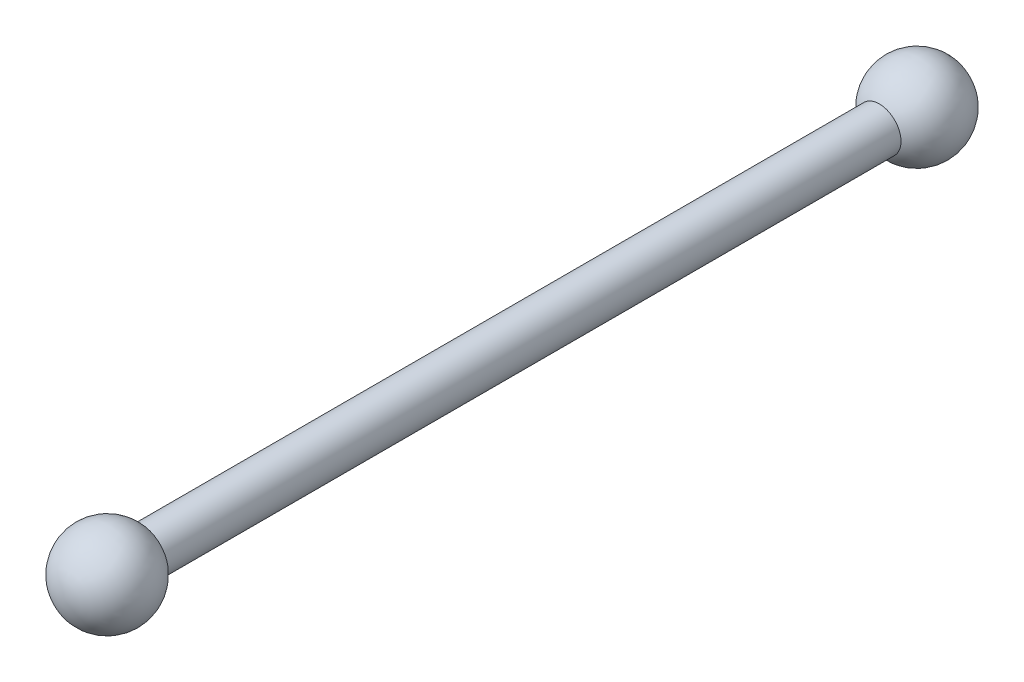
ISO-10303-21;
HEADER;
FILE_DESCRIPTION(('STEP AP214'),'2;1');
FILE_NAME('part.step','',(''),(''),'','','');
FILE_SCHEMA(('AUTOMOTIVE_DESIGN { 1 0 10303 214 1 1 1 1 }'));
ENDSEC;
DATA;
#1=APPLICATION_CONTEXT('core data for automotive mechanical design processes');
#2=APPLICATION_PROTOCOL_DEFINITION('international standard','automotive_design',2000,#1);
#3=PRODUCT_CONTEXT('',#1,'mechanical');
#4=PRODUCT('Part','Part','',(#3));
#5=PRODUCT_RELATED_PRODUCT_CATEGORY('part','',(#4));
#6=PRODUCT_DEFINITION_FORMATION('','',#4);
#7=PRODUCT_DEFINITION_CONTEXT('part definition',#1,'design');
#8=PRODUCT_DEFINITION('design','',#6,#7);
#9=PRODUCT_DEFINITION_SHAPE('','',#8);
#10=(LENGTH_UNIT() NAMED_UNIT(*) SI_UNIT(.MILLI.,.METRE.));
#11=(NAMED_UNIT(*) PLANE_ANGLE_UNIT() SI_UNIT($,.RADIAN.));
#12=(NAMED_UNIT(*) SI_UNIT($,.STERADIAN.) SOLID_ANGLE_UNIT());
#13=UNCERTAINTY_MEASURE_WITH_UNIT(LENGTH_MEASURE(1.E-05),#10,'distance_accuracy_value','');
#14=(GEOMETRIC_REPRESENTATION_CONTEXT(3) GLOBAL_UNCERTAINTY_ASSIGNED_CONTEXT((#13)) GLOBAL_UNIT_ASSIGNED_CONTEXT((#10,
#11,#12)) REPRESENTATION_CONTEXT('',''));
#15=CARTESIAN_POINT('',(0.,0.,0.));
#16=DIRECTION('',(0.,0.,1.));
#17=DIRECTION('',(1.,0.,0.));
#18=AXIS2_PLACEMENT_3D('',#15,#16,#17);
#19=CARTESIAN_POINT('',(0.,-0.75,-15.));
#20=DIRECTION('',(0.,0.,1.));
#21=DIRECTION('',(0.,1.,0.));
#22=AXIS2_PLACEMENT_3D('',#19,#20,#21);
#23=SPHERICAL_SURFACE('',#22,3.);
#24=CARTESIAN_POINT('',(0.,-0.75,-12.4019237886467));
#25=DIRECTION('',(0.,0.,1.));
#26=DIRECTION('',(1.,0.,0.));
#27=AXIS2_PLACEMENT_3D('',#24,#25,#26);
#28=CIRCLE('',#27,1.5);
#29=CARTESIAN_POINT('',(1.5,-0.75,-12.4019237886467));
#30=VERTEX_POINT('',#29);
#31=EDGE_CURVE('E10',#30,#30,#28,.T.);
#32=ORIENTED_EDGE('',*,*,#31,.F.);
#33=EDGE_LOOP('',(#32));
#34=FACE_BOUND('',#33,.T.);
#35=ADVANCED_FACE('F36',(#34),#23,.T.);
#36=CARTESIAN_POINT('',(0.,-0.75,13.));
#37=DIRECTION('',(0.,0.,1.));
#38=DIRECTION('',(1.,0.,0.));
#39=AXIS2_PLACEMENT_3D('',#36,#37,#38);
#40=CYLINDRICAL_SURFACE('',#39,1.5);
#41=ORIENTED_EDGE('',*,*,#31,.T.);
#42=EDGE_LOOP('',(#41));
#43=FACE_BOUND('',#42,.T.);
#44=CARTESIAN_POINT('',(0.,-0.75,38.4019237886467));
#45=DIRECTION('',(0.,0.,1.));
#46=DIRECTION('',(1.,0.,0.));
#47=AXIS2_PLACEMENT_3D('',#44,#45,#46);
#48=CIRCLE('',#47,1.5);
#49=CARTESIAN_POINT('',(1.5,-0.75,38.4019237886467));
#50=VERTEX_POINT('',#49);
#51=EDGE_CURVE('E42',#50,#50,#48,.T.);
#52=ORIENTED_EDGE('',*,*,#51,.F.);
#53=EDGE_LOOP('',(#52));
#54=FACE_BOUND('',#53,.T.);
#55=ADVANCED_FACE('F50',(#43,#54),#40,.T.);
#56=CARTESIAN_POINT('',(0.,-0.75,41.));
#57=DIRECTION('',(0.,0.,-1.));
#58=DIRECTION('',(0.,1.,0.));
#59=AXIS2_PLACEMENT_3D('',#56,#57,#58);
#60=SPHERICAL_SURFACE('',#59,3.);
#61=ORIENTED_EDGE('',*,*,#51,.T.);
#62=EDGE_LOOP('',(#61));
#63=FACE_BOUND('',#62,.T.);
#64=ADVANCED_FACE('F48',(#63),#60,.T.);
#65=CLOSED_SHELL('',(#35,#55,#64));
#66=MANIFOLD_SOLID_BREP('B2',#65);
#67=ADVANCED_BREP_SHAPE_REPRESENTATION('',(#18,#66),#14);
#68=SHAPE_DEFINITION_REPRESENTATION(#9,#67);
ENDSEC;
END-ISO-10303-21;
